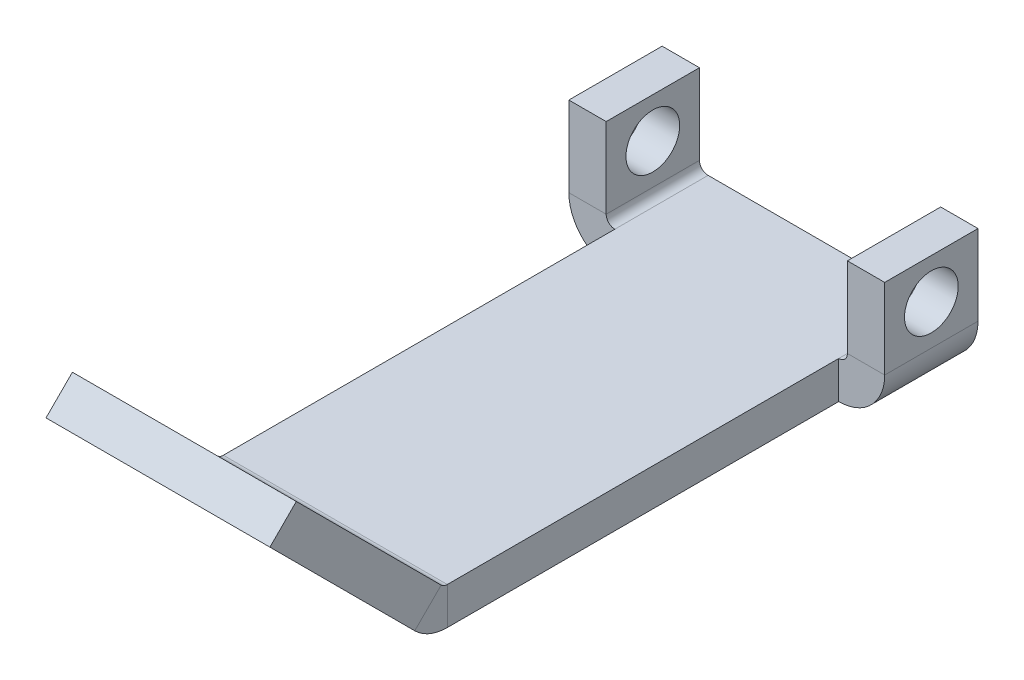
ISO-10303-21;
HEADER;
FILE_DESCRIPTION(('STEP AP214'),'2;1');
FILE_NAME('part.step','',(''),(''),'','','');
FILE_SCHEMA(('AUTOMOTIVE_DESIGN { 1 0 10303 214 1 1 1 1 }'));
ENDSEC;
DATA;
#1=APPLICATION_CONTEXT('core data for automotive mechanical design processes');
#2=APPLICATION_PROTOCOL_DEFINITION('international standard','automotive_design',2000,#1);
#3=PRODUCT_CONTEXT('',#1,'mechanical');
#4=PRODUCT('Part','Part','',(#3));
#5=PRODUCT_RELATED_PRODUCT_CATEGORY('part','',(#4));
#6=PRODUCT_DEFINITION_FORMATION('','',#4);
#7=PRODUCT_DEFINITION_CONTEXT('part definition',#1,'design');
#8=PRODUCT_DEFINITION('design','',#6,#7);
#9=PRODUCT_DEFINITION_SHAPE('','',#8);
#10=(LENGTH_UNIT() NAMED_UNIT(*) SI_UNIT(.MILLI.,.METRE.));
#11=(NAMED_UNIT(*) PLANE_ANGLE_UNIT() SI_UNIT($,.RADIAN.));
#12=(NAMED_UNIT(*) SI_UNIT($,.STERADIAN.) SOLID_ANGLE_UNIT());
#13=UNCERTAINTY_MEASURE_WITH_UNIT(LENGTH_MEASURE(1.E-05),#10,'distance_accuracy_value','');
#14=(GEOMETRIC_REPRESENTATION_CONTEXT(3) GLOBAL_UNCERTAINTY_ASSIGNED_CONTEXT((#13)) GLOBAL_UNIT_ASSIGNED_CONTEXT((#10,
#11,#12)) REPRESENTATION_CONTEXT('',''));
#15=CARTESIAN_POINT('',(0.,0.,0.));
#16=DIRECTION('',(0.,0.,1.));
#17=DIRECTION('',(1.,0.,0.));
#18=AXIS2_PLACEMENT_3D('',#15,#16,#17);
#19=CARTESIAN_POINT('',(0.,0.,0.));
#20=DIRECTION('',(0.,1.,0.));
#21=DIRECTION('',(0.,0.,1.));
#22=AXIS2_PLACEMENT_3D('',#19,#20,#21);
#23=PLANE('',#22);
#24=DIRECTION('',(0.,0.,1.));
#25=VECTOR('',#24,1.);
#26=CARTESIAN_POINT('',(0.,0.,0.));
#27=LINE('',#26,#25);
#28=CARTESIAN_POINT('',(0.,0.,-38.1));
#29=VERTEX_POINT('',#28);
#30=CARTESIAN_POINT('',(0.,0.,-4.79523777057862));
#31=VERTEX_POINT('',#30);
#32=EDGE_CURVE('E352',#29,#31,#27,.T.);
#33=ORIENTED_EDGE('',*,*,#32,.T.);
#34=DIRECTION('',(1.,0.,0.));
#35=VECTOR('',#34,1.);
#36=CARTESIAN_POINT('',(19.05,0.,-4.79523777057862));
#37=LINE('',#36,#35);
#38=CARTESIAN_POINT('',(19.05,0.,-4.79523777057862));
#39=VERTEX_POINT('',#38);
#40=EDGE_CURVE('E264',#39,#31,#37,.F.);
#41=ORIENTED_EDGE('',*,*,#40,.F.);
#42=DIRECTION('',(0.,0.,-1.));
#43=VECTOR('',#42,1.);
#44=CARTESIAN_POINT('',(19.05,0.,0.));
#45=LINE('',#44,#43);
#46=CARTESIAN_POINT('',(19.05,0.,-38.1));
#47=VERTEX_POINT('',#46);
#48=EDGE_CURVE('E98',#39,#47,#45,.T.);
#49=ORIENTED_EDGE('',*,*,#48,.T.);
#50=DIRECTION('',(0.,0.,1.));
#51=VECTOR('',#50,1.);
#52=CARTESIAN_POINT('',(19.05,0.,0.));
#53=LINE('',#52,#51);
#54=CARTESIAN_POINT('',(19.05,0.,-46.0375));
#55=VERTEX_POINT('',#54);
#56=EDGE_CURVE('E372',#55,#47,#53,.T.);
#57=ORIENTED_EDGE('',*,*,#56,.F.);
#58=DIRECTION('',(-1.,0.,0.));
#59=VECTOR('',#58,1.);
#60=CARTESIAN_POINT('',(29.5275,0.,-46.0375));
#61=LINE('',#60,#59);
#62=CARTESIAN_POINT('',(0.,0.,-46.0375));
#63=VERTEX_POINT('',#62);
#64=EDGE_CURVE('E361',#55,#63,#61,.T.);
#65=ORIENTED_EDGE('',*,*,#64,.T.);
#66=DIRECTION('',(0.,0.,1.));
#67=VECTOR('',#66,1.);
#68=CARTESIAN_POINT('',(0.,0.,0.));
#69=LINE('',#68,#67);
#70=EDGE_CURVE('E82',#63,#29,#69,.T.);
#71=ORIENTED_EDGE('',*,*,#70,.T.);
#72=EDGE_LOOP('',(#33,#41,#49,#57,#65,#71));
#73=FACE_BOUND('',#72,.T.);
#74=ADVANCED_FACE('F73',(#73),#23,.T.);
#75=CARTESIAN_POINT('',(0.,-3.175,0.));
#76=DIRECTION('',(0.,1.,0.));
#77=DIRECTION('',(0.,0.,1.));
#78=AXIS2_PLACEMENT_3D('',#75,#76,#77);
#79=PLANE('',#78);
#80=DIRECTION('',(1.,0.,0.));
#81=VECTOR('',#80,1.);
#82=CARTESIAN_POINT('',(19.05,-3.175,-4.79523777057862));
#83=LINE('',#82,#81);
#84=CARTESIAN_POINT('',(19.05,-3.175,-4.79523777057862));
#85=VERTEX_POINT('',#84);
#86=CARTESIAN_POINT('',(0.,-3.175,-4.79523777057862));
#87=VERTEX_POINT('',#86);
#88=EDGE_CURVE('E209',#85,#87,#83,.F.);
#89=ORIENTED_EDGE('',*,*,#88,.T.);
#90=DIRECTION('',(0.,0.,1.));
#91=VECTOR('',#90,1.);
#92=CARTESIAN_POINT('',(0.,-3.175,0.));
#93=LINE('',#92,#91);
#94=CARTESIAN_POINT('',(0.,-3.175,-38.1));
#95=VERTEX_POINT('',#94);
#96=EDGE_CURVE('E357',#95,#87,#93,.T.);
#97=ORIENTED_EDGE('',*,*,#96,.F.);
#98=DIRECTION('',(0.,0.,1.));
#99=VECTOR('',#98,1.);
#100=CARTESIAN_POINT('',(0.,-3.175,0.));
#101=LINE('',#100,#99);
#102=CARTESIAN_POINT('',(0.,-3.175,-46.0375));
#103=VERTEX_POINT('',#102);
#104=EDGE_CURVE('E377',#103,#95,#101,.T.);
#105=ORIENTED_EDGE('',*,*,#104,.F.);
#106=DIRECTION('',(-1.,0.,0.));
#107=VECTOR('',#106,1.);
#108=CARTESIAN_POINT('',(29.5275,-3.175,-46.0375));
#109=LINE('',#108,#107);
#110=CARTESIAN_POINT('',(19.05,-3.175,-46.0375));
#111=VERTEX_POINT('',#110);
#112=EDGE_CURVE('E363',#111,#103,#109,.T.);
#113=ORIENTED_EDGE('',*,*,#112,.F.);
#114=DIRECTION('',(0.,0.,1.));
#115=VECTOR('',#114,1.);
#116=CARTESIAN_POINT('',(19.05,-3.175,0.));
#117=LINE('',#116,#115);
#118=CARTESIAN_POINT('',(19.05,-3.175,-38.1));
#119=VERTEX_POINT('',#118);
#120=EDGE_CURVE('E367',#111,#119,#117,.T.);
#121=ORIENTED_EDGE('',*,*,#120,.T.);
#122=DIRECTION('',(0.,0.,-1.));
#123=VECTOR('',#122,1.);
#124=CARTESIAN_POINT('',(19.05,-3.175,0.));
#125=LINE('',#124,#123);
#126=EDGE_CURVE('E360',#85,#119,#125,.T.);
#127=ORIENTED_EDGE('',*,*,#126,.F.);
#128=EDGE_LOOP('',(#89,#97,#105,#113,#121,#127));
#129=FACE_BOUND('',#128,.T.);
#130=ADVANCED_FACE('F398',(#129),#79,.F.);
#131=CARTESIAN_POINT('',(19.05,-3.175,0.));
#132=DIRECTION('',(1.,0.,0.));
#133=DIRECTION('',(0.,0.,-1.));
#134=AXIS2_PLACEMENT_3D('',#131,#132,#133);
#135=PLANE('',#134);
#136=ORIENTED_EDGE('',*,*,#48,.F.);
#137=DIRECTION('',(0.,-1.,0.));
#138=VECTOR('',#137,1.);
#139=CARTESIAN_POINT('',(19.05,0.,-4.79523777057862));
#140=LINE('',#139,#138);
#141=EDGE_CURVE('E260',#39,#85,#140,.T.);
#142=ORIENTED_EDGE('',*,*,#141,.T.);
#143=ORIENTED_EDGE('',*,*,#126,.T.);
#144=DIRECTION('',(0.,1.,0.));
#145=VECTOR('',#144,1.);
#146=CARTESIAN_POINT('',(19.05,-3.175,-38.1));
#147=LINE('',#146,#145);
#148=EDGE_CURVE('E374',#119,#47,#147,.T.);
#149=ORIENTED_EDGE('',*,*,#148,.T.);
#150=EDGE_LOOP('',(#136,#142,#143,#149));
#151=FACE_BOUND('',#150,.T.);
#152=ADVANCED_FACE('F442',(#151),#135,.T.);
#153=CARTESIAN_POINT('',(29.5275,-3.175,-46.0375));
#154=DIRECTION('',(0.,0.,-1.));
#155=DIRECTION('',(-1.,0.,0.));
#156=AXIS2_PLACEMENT_3D('',#153,#154,#155);
#157=PLANE('',#156);
#158=ORIENTED_EDGE('',*,*,#112,.T.);
#159=DIRECTION('',(0.,1.,0.));
#160=VECTOR('',#159,1.);
#161=CARTESIAN_POINT('',(0.,-3.175,-46.0375));
#162=LINE('',#161,#160);
#163=EDGE_CURVE('E13',#103,#63,#162,.T.);
#164=ORIENTED_EDGE('',*,*,#163,.T.);
#165=ORIENTED_EDGE('',*,*,#64,.F.);
#166=DIRECTION('',(0.,1.,0.));
#167=VECTOR('',#166,1.);
#168=CARTESIAN_POINT('',(19.05,-3.175,-46.0375));
#169=LINE('',#168,#167);
#170=EDGE_CURVE('E370',#111,#55,#169,.T.);
#171=ORIENTED_EDGE('',*,*,#170,.F.);
#172=EDGE_LOOP('',(#158,#164,#165,#171));
#173=FACE_BOUND('',#172,.T.);
#174=ADVANCED_FACE('F75',(#173),#157,.T.);
#175=CARTESIAN_POINT('',(0.,-3.175,0.));
#176=DIRECTION('',(-1.,0.,0.));
#177=DIRECTION('',(0.,0.,1.));
#178=AXIS2_PLACEMENT_3D('',#175,#176,#177);
#179=PLANE('',#178);
#180=DIRECTION('',(0.,-1.,0.));
#181=VECTOR('',#180,1.);
#182=CARTESIAN_POINT('',(0.,0.,-4.79523777057862));
#183=LINE('',#182,#181);
#184=EDGE_CURVE('E268',#31,#87,#183,.T.);
#185=ORIENTED_EDGE('',*,*,#184,.F.);
#186=ORIENTED_EDGE('',*,*,#32,.F.);
#187=DIRECTION('',(0.,1.,0.));
#188=VECTOR('',#187,1.);
#189=CARTESIAN_POINT('',(0.,-3.175,-38.1));
#190=LINE('',#189,#188);
#191=EDGE_CURVE('E379',#95,#29,#190,.T.);
#192=ORIENTED_EDGE('',*,*,#191,.F.);
#193=ORIENTED_EDGE('',*,*,#96,.T.);
#194=EDGE_LOOP('',(#185,#186,#192,#193));
#195=FACE_BOUND('',#194,.T.);
#196=ADVANCED_FACE('F402',(#195),#179,.T.);
#197=CARTESIAN_POINT('',(19.05,0.7366,-46.0375));
#198=DIRECTION('',(0.,0.,-1.));
#199=DIRECTION('',(-1.,0.,0.));
#200=AXIS2_PLACEMENT_3D('',#197,#198,#199);
#201=PLANE('',#200);
#202=ORIENTED_EDGE('',*,*,#170,.T.);
#203=CARTESIAN_POINT('',(19.05,0.7366,-46.0375));
#204=DIRECTION('',(0.,0.,1.));
#205=DIRECTION('',(1.,0.,0.));
#206=AXIS2_PLACEMENT_3D('',#203,#204,#205);
#207=CIRCLE('',#206,0.7366);
#208=CARTESIAN_POINT('',(19.7866,0.736600000000004,-46.0375));
#209=VERTEX_POINT('',#208);
#210=EDGE_CURVE('E317',#55,#209,#207,.T.);
#211=ORIENTED_EDGE('',*,*,#210,.T.);
#212=DIRECTION('',(-1.,0.,0.));
#213=VECTOR('',#212,1.);
#214=CARTESIAN_POINT('',(22.9616,0.736600000000014,-46.0375));
#215=LINE('',#214,#213);
#216=CARTESIAN_POINT('',(22.9616,0.736600000000014,-46.0375));
#217=VERTEX_POINT('',#216);
#218=EDGE_CURVE('E332',#217,#209,#215,.T.);
#219=ORIENTED_EDGE('',*,*,#218,.F.);
#220=CARTESIAN_POINT('',(19.05,0.7366,-46.0375));
#221=DIRECTION('',(0.,0.,1.));
#222=DIRECTION('',(-1.,0.,0.));
#223=AXIS2_PLACEMENT_3D('',#220,#221,#222);
#224=CIRCLE('',#223,3.9116);
#225=EDGE_CURVE('E345',#111,#217,#224,.T.);
#226=ORIENTED_EDGE('',*,*,#225,.F.);
#227=EDGE_LOOP('',(#202,#211,#219,#226));
#228=FACE_BOUND('',#227,.T.);
#229=ADVANCED_FACE('F447',(#228),#201,.T.);
#230=CARTESIAN_POINT('',(19.05,0.7366,-38.1));
#231=DIRECTION('',(0.,0.,1.));
#232=DIRECTION('',(1.,0.,0.));
#233=AXIS2_PLACEMENT_3D('',#230,#231,#232);
#234=PLANE('',#233);
#235=DIRECTION('',(1.,0.,0.));
#236=VECTOR('',#235,1.);
#237=CARTESIAN_POINT('',(22.9616,0.736600000000014,-38.1));
#238=LINE('',#237,#236);
#239=CARTESIAN_POINT('',(19.7866,0.736600000000004,-38.1));
#240=VERTEX_POINT('',#239);
#241=CARTESIAN_POINT('',(22.9616,0.736600000000011,-38.1));
#242=VERTEX_POINT('',#241);
#243=EDGE_CURVE('E320',#240,#242,#238,.T.);
#244=ORIENTED_EDGE('',*,*,#243,.F.);
#245=CARTESIAN_POINT('',(19.05,0.7366,-38.1));
#246=DIRECTION('',(0.,0.,1.));
#247=DIRECTION('',(1.,0.,0.));
#248=AXIS2_PLACEMENT_3D('',#245,#246,#247);
#249=CIRCLE('',#248,0.7366);
#250=EDGE_CURVE('E349',#240,#47,#249,.F.);
#251=ORIENTED_EDGE('',*,*,#250,.T.);
#252=ORIENTED_EDGE('',*,*,#148,.F.);
#253=CARTESIAN_POINT('',(19.05,0.7366,-38.1));
#254=DIRECTION('',(0.,0.,-1.));
#255=DIRECTION('',(1.,0.,0.));
#256=AXIS2_PLACEMENT_3D('',#253,#254,#255);
#257=CIRCLE('',#256,3.9116);
#258=EDGE_CURVE('E348',#242,#119,#257,.T.);
#259=ORIENTED_EDGE('',*,*,#258,.F.);
#260=EDGE_LOOP('',(#244,#251,#252,#259));
#261=FACE_BOUND('',#260,.T.);
#262=ADVANCED_FACE('F453',(#261),#234,.T.);
#263=CARTESIAN_POINT('',(19.05,0.7366,-51.3645583159911));
#264=DIRECTION('',(0.,0.,1.));
#265=DIRECTION('',(1.,0.,0.));
#266=AXIS2_PLACEMENT_3D('',#263,#264,#265);
#267=CYLINDRICAL_SURFACE('',#266,3.9116);
#268=ORIENTED_EDGE('',*,*,#258,.T.);
#269=ORIENTED_EDGE('',*,*,#120,.F.);
#270=ORIENTED_EDGE('',*,*,#225,.T.);
#271=DIRECTION('',(0.,0.,1.));
#272=VECTOR('',#271,1.);
#273=CARTESIAN_POINT('',(22.9616,0.736600000000014,0.));
#274=LINE('',#273,#272);
#275=EDGE_CURVE('E310',#217,#242,#274,.T.);
#276=ORIENTED_EDGE('',*,*,#275,.T.);
#277=EDGE_LOOP('',(#268,#269,#270,#276));
#278=FACE_BOUND('',#277,.T.);
#279=ADVANCED_FACE('F457',(#278),#267,.T.);
#280=CARTESIAN_POINT('',(19.05,0.7366,-51.3645583159911));
#281=DIRECTION('',(0.,0.,1.));
#282=DIRECTION('',(1.,0.,0.));
#283=AXIS2_PLACEMENT_3D('',#280,#281,#282);
#284=CYLINDRICAL_SURFACE('',#283,0.7366);
#285=ORIENTED_EDGE('',*,*,#250,.F.);
#286=DIRECTION('',(0.,0.,1.));
#287=VECTOR('',#286,1.);
#288=CARTESIAN_POINT('',(19.7866,0.736600000000004,0.));
#289=LINE('',#288,#287);
#290=EDGE_CURVE('E327',#209,#240,#289,.T.);
#291=ORIENTED_EDGE('',*,*,#290,.F.);
#292=ORIENTED_EDGE('',*,*,#210,.F.);
#293=ORIENTED_EDGE('',*,*,#56,.T.);
#294=EDGE_LOOP('',(#285,#291,#292,#293));
#295=FACE_BOUND('',#294,.T.);
#296=ADVANCED_FACE('F459',(#295),#284,.F.);
#297=CARTESIAN_POINT('',(22.9616,7.56341225689599,-38.1));
#298=DIRECTION('',(0.,1.,0.));
#299=DIRECTION('',(0.,0.,-1.));
#300=AXIS2_PLACEMENT_3D('',#297,#298,#299);
#301=PLANE('',#300);
#302=DIRECTION('',(0.,0.,-1.));
#303=VECTOR('',#302,1.);
#304=CARTESIAN_POINT('',(19.7866,7.56341225689598,-38.1));
#305=LINE('',#304,#303);
#306=CARTESIAN_POINT('',(19.7866,7.56341225689598,-38.1));
#307=VERTEX_POINT('',#306);
#308=CARTESIAN_POINT('',(19.7866,7.56341225689598,-46.0375));
#309=VERTEX_POINT('',#308);
#310=EDGE_CURVE('E322',#307,#309,#305,.T.);
#311=ORIENTED_EDGE('',*,*,#310,.F.);
#312=DIRECTION('',(-1.,0.,0.));
#313=VECTOR('',#312,1.);
#314=CARTESIAN_POINT('',(22.9616,7.56341225689599,-38.1));
#315=LINE('',#314,#313);
#316=CARTESIAN_POINT('',(22.9616,7.56341225689599,-38.1));
#317=VERTEX_POINT('',#316);
#318=EDGE_CURVE('E314',#317,#307,#315,.T.);
#319=ORIENTED_EDGE('',*,*,#318,.F.);
#320=DIRECTION('',(0.,0.,-1.));
#321=VECTOR('',#320,1.);
#322=CARTESIAN_POINT('',(22.9616,7.56341225689599,-38.1));
#323=LINE('',#322,#321);
#324=CARTESIAN_POINT('',(22.9616,7.56341225689599,-46.0375));
#325=VERTEX_POINT('',#324);
#326=EDGE_CURVE('E340',#317,#325,#323,.T.);
#327=ORIENTED_EDGE('',*,*,#326,.T.);
#328=DIRECTION('',(-1.,0.,0.));
#329=VECTOR('',#328,1.);
#330=CARTESIAN_POINT('',(22.9616,7.56341225689599,-46.0375));
#331=LINE('',#330,#329);
#332=EDGE_CURVE('E338',#325,#309,#331,.T.);
#333=ORIENTED_EDGE('',*,*,#332,.T.);
#334=EDGE_LOOP('',(#311,#319,#327,#333));
#335=FACE_BOUND('',#334,.T.);
#336=ADVANCED_FACE('F462',(#335),#301,.T.);
#337=CARTESIAN_POINT('',(22.9616000000001,-21.964087743104,0.));
#338=DIRECTION('',(-1.,0.,0.));
#339=DIRECTION('',(0.,0.,1.));
#340=AXIS2_PLACEMENT_3D('',#337,#338,#339);
#341=PLANE('',#340);
#342=CARTESIAN_POINT('',(22.9616,4.15000612844791,-42.06875));
#343=DIRECTION('',(-1.,0.,0.));
#344=DIRECTION('',(0.,-1.,0.));
#345=AXIS2_PLACEMENT_3D('',#342,#343,#344);
#346=CIRCLE('',#345,2.286);
#347=CARTESIAN_POINT('',(22.9616,1.8640061284479,-42.06875));
#348=VERTEX_POINT('',#347);
#349=EDGE_CURVE('E787',#348,#348,#346,.T.);
#350=ORIENTED_EDGE('',*,*,#349,.T.);
#351=EDGE_LOOP('',(#350));
#352=FACE_BOUND('',#351,.T.);
#353=ORIENTED_EDGE('',*,*,#275,.F.);
#354=DIRECTION('',(0.,-1.,0.));
#355=VECTOR('',#354,1.);
#356=CARTESIAN_POINT('',(22.9616,7.56341225689599,-46.0375));
#357=LINE('',#356,#355);
#358=EDGE_CURVE('E335',#325,#217,#357,.T.);
#359=ORIENTED_EDGE('',*,*,#358,.F.);
#360=ORIENTED_EDGE('',*,*,#326,.F.);
#361=DIRECTION('',(0.,1.,0.));
#362=VECTOR('',#361,1.);
#363=CARTESIAN_POINT('',(22.9616,-2.91408774310401,-38.1));
#364=LINE('',#363,#362);
#365=EDGE_CURVE('E318',#242,#317,#364,.T.);
#366=ORIENTED_EDGE('',*,*,#365,.F.);
#367=EDGE_LOOP('',(#353,#359,#360,#366));
#368=FACE_BOUND('',#367,.T.);
#369=ADVANCED_FACE('F478',(#352,#368),#341,.F.);
#370=CARTESIAN_POINT('',(22.9616,7.56341225689599,-46.0375));
#371=DIRECTION('',(0.,0.,-1.));
#372=DIRECTION('',(0.,-1.,0.));
#373=AXIS2_PLACEMENT_3D('',#370,#371,#372);
#374=PLANE('',#373);
#375=ORIENTED_EDGE('',*,*,#358,.T.);
#376=ORIENTED_EDGE('',*,*,#218,.T.);
#377=DIRECTION('',(0.,-1.,0.));
#378=VECTOR('',#377,1.);
#379=CARTESIAN_POINT('',(19.7866,7.56341225689598,-46.0375));
#380=LINE('',#379,#378);
#381=EDGE_CURVE('E330',#309,#209,#380,.T.);
#382=ORIENTED_EDGE('',*,*,#381,.F.);
#383=ORIENTED_EDGE('',*,*,#332,.F.);
#384=EDGE_LOOP('',(#375,#376,#382,#383));
#385=FACE_BOUND('',#384,.T.);
#386=ADVANCED_FACE('F474',(#385),#374,.T.);
#387=CARTESIAN_POINT('',(19.7866000000001,-21.964087743104,0.));
#388=DIRECTION('',(-1.,0.,0.));
#389=DIRECTION('',(0.,0.,1.));
#390=AXIS2_PLACEMENT_3D('',#387,#388,#389);
#391=PLANE('',#390);
#392=CARTESIAN_POINT('',(19.7866,4.15000612844792,-42.06875));
#393=DIRECTION('',(-1.,0.,0.));
#394=DIRECTION('',(0.,-1.,0.));
#395=AXIS2_PLACEMENT_3D('',#392,#393,#394);
#396=CIRCLE('',#395,2.286);
#397=CARTESIAN_POINT('',(19.7866,1.86400612844792,-42.06875));
#398=VERTEX_POINT('',#397);
#399=EDGE_CURVE('E257',#398,#398,#396,.T.);
#400=ORIENTED_EDGE('',*,*,#399,.F.);
#401=EDGE_LOOP('',(#400));
#402=FACE_BOUND('',#401,.T.);
#403=ORIENTED_EDGE('',*,*,#381,.T.);
#404=ORIENTED_EDGE('',*,*,#290,.T.);
#405=DIRECTION('',(0.,1.,0.));
#406=VECTOR('',#405,1.);
#407=CARTESIAN_POINT('',(19.7866,-2.91408774310402,-38.1));
#408=LINE('',#407,#406);
#409=EDGE_CURVE('E325',#240,#307,#408,.T.);
#410=ORIENTED_EDGE('',*,*,#409,.T.);
#411=ORIENTED_EDGE('',*,*,#310,.T.);
#412=EDGE_LOOP('',(#403,#404,#410,#411));
#413=FACE_BOUND('',#412,.T.);
#414=ADVANCED_FACE('F470',(#402,#413),#391,.T.);
#415=CARTESIAN_POINT('',(22.9616,-2.91408774310401,-38.1));
#416=DIRECTION('',(0.,0.,1.));
#417=DIRECTION('',(0.,1.,0.));
#418=AXIS2_PLACEMENT_3D('',#415,#416,#417);
#419=PLANE('',#418);
#420=ORIENTED_EDGE('',*,*,#409,.F.);
#421=ORIENTED_EDGE('',*,*,#243,.T.);
#422=ORIENTED_EDGE('',*,*,#365,.T.);
#423=ORIENTED_EDGE('',*,*,#318,.T.);
#424=EDGE_LOOP('',(#420,#421,#422,#423));
#425=FACE_BOUND('',#424,.T.);
#426=ADVANCED_FACE('F467',(#425),#419,.T.);
#427=CARTESIAN_POINT('',(0.,0.7366,-46.0375));
#428=DIRECTION('',(0.,0.,-1.));
#429=DIRECTION('',(-1.,0.,0.));
#430=AXIS2_PLACEMENT_3D('',#427,#428,#429);
#431=PLANE('',#430);
#432=DIRECTION('',(1.,0.,0.));
#433=VECTOR('',#432,1.);
#434=CARTESIAN_POINT('',(-3.9116,0.736600000000013,-46.0375));
#435=LINE('',#434,#433);
#436=CARTESIAN_POINT('',(-3.9116,0.736600000000017,-46.0375));
#437=VERTEX_POINT('',#436);
#438=CARTESIAN_POINT('',(-0.736600000000001,0.736600000000001,-46.0375));
#439=VERTEX_POINT('',#438);
#440=EDGE_CURVE('E271',#437,#439,#435,.T.);
#441=ORIENTED_EDGE('',*,*,#440,.T.);
#442=CARTESIAN_POINT('',(0.,0.7366,-46.0375));
#443=DIRECTION('',(0.,0.,-1.));
#444=DIRECTION('',(-1.,0.,0.));
#445=AXIS2_PLACEMENT_3D('',#442,#443,#444);
#446=CIRCLE('',#445,0.7366);
#447=EDGE_CURVE('E90',#439,#63,#446,.F.);
#448=ORIENTED_EDGE('',*,*,#447,.T.);
#449=ORIENTED_EDGE('',*,*,#163,.F.);
#450=CARTESIAN_POINT('',(0.,0.7366,-46.0375));
#451=DIRECTION('',(0.,0.,1.));
#452=DIRECTION('',(-1.,0.,0.));
#453=AXIS2_PLACEMENT_3D('',#450,#451,#452);
#454=CIRCLE('',#453,3.9116);
#455=EDGE_CURVE('E303',#437,#103,#454,.T.);
#456=ORIENTED_EDGE('',*,*,#455,.F.);
#457=EDGE_LOOP('',(#441,#448,#449,#456));
#458=FACE_BOUND('',#457,.T.);
#459=ADVANCED_FACE('F390',(#458),#431,.T.);
#460=CARTESIAN_POINT('',(0.,0.7366,-38.1));
#461=DIRECTION('',(0.,0.,1.));
#462=DIRECTION('',(1.,0.,0.));
#463=AXIS2_PLACEMENT_3D('',#460,#461,#462);
#464=PLANE('',#463);
#465=CARTESIAN_POINT('',(0.,0.7366,-38.1));
#466=DIRECTION('',(0.,0.,-1.));
#467=DIRECTION('',(-1.,0.,0.));
#468=AXIS2_PLACEMENT_3D('',#465,#466,#467);
#469=CIRCLE('',#468,0.7366);
#470=CARTESIAN_POINT('',(-0.736600000000001,0.736599999999999,-38.1));
#471=VERTEX_POINT('',#470);
#472=EDGE_CURVE('E307',#29,#471,#469,.T.);
#473=ORIENTED_EDGE('',*,*,#472,.T.);
#474=DIRECTION('',(-1.,0.,0.));
#475=VECTOR('',#474,1.);
#476=CARTESIAN_POINT('',(-3.9116,0.73660000000001,-38.1));
#477=LINE('',#476,#475);
#478=CARTESIAN_POINT('',(-3.9116,0.73660000000001,-38.1));
#479=VERTEX_POINT('',#478);
#480=EDGE_CURVE('E296',#471,#479,#477,.T.);
#481=ORIENTED_EDGE('',*,*,#480,.T.);
#482=CARTESIAN_POINT('',(0.,0.7366,-38.1));
#483=DIRECTION('',(0.,0.,-1.));
#484=DIRECTION('',(1.,0.,0.));
#485=AXIS2_PLACEMENT_3D('',#482,#483,#484);
#486=CIRCLE('',#485,3.9116);
#487=EDGE_CURVE('E306',#95,#479,#486,.T.);
#488=ORIENTED_EDGE('',*,*,#487,.F.);
#489=ORIENTED_EDGE('',*,*,#191,.T.);
#490=EDGE_LOOP('',(#473,#481,#488,#489));
#491=FACE_BOUND('',#490,.T.);
#492=ADVANCED_FACE('F405',(#491),#464,.T.);
#493=CARTESIAN_POINT('',(0.,0.7366,-32.7729416840089));
#494=DIRECTION('',(0.,0.,-1.));
#495=DIRECTION('',(-1.,0.,0.));
#496=AXIS2_PLACEMENT_3D('',#493,#494,#495);
#497=CYLINDRICAL_SURFACE('',#496,3.9116);
#498=ORIENTED_EDGE('',*,*,#104,.T.);
#499=ORIENTED_EDGE('',*,*,#487,.T.);
#500=DIRECTION('',(0.,0.,1.));
#501=VECTOR('',#500,1.);
#502=CARTESIAN_POINT('',(-3.9116,0.73660000000001,0.));
#503=LINE('',#502,#501);
#504=EDGE_CURVE('E289',#437,#479,#503,.T.);
#505=ORIENTED_EDGE('',*,*,#504,.F.);
#506=ORIENTED_EDGE('',*,*,#455,.T.);
#507=EDGE_LOOP('',(#498,#499,#505,#506));
#508=FACE_BOUND('',#507,.T.);
#509=ADVANCED_FACE('F394',(#508),#497,.T.);
#510=CARTESIAN_POINT('',(0.,0.7366,-32.7729416840089));
#511=DIRECTION('',(0.,0.,-1.));
#512=DIRECTION('',(-1.,0.,0.));
#513=AXIS2_PLACEMENT_3D('',#510,#511,#512);
#514=CYLINDRICAL_SURFACE('',#513,0.7366);
#515=ORIENTED_EDGE('',*,*,#70,.F.);
#516=ORIENTED_EDGE('',*,*,#447,.F.);
#517=DIRECTION('',(0.,0.,1.));
#518=VECTOR('',#517,1.);
#519=CARTESIAN_POINT('',(-0.736600000000001,0.736599999999999,0.));
#520=LINE('',#519,#518);
#521=EDGE_CURVE('E299',#439,#471,#520,.T.);
#522=ORIENTED_EDGE('',*,*,#521,.T.);
#523=ORIENTED_EDGE('',*,*,#472,.F.);
#524=EDGE_LOOP('',(#515,#516,#522,#523));
#525=FACE_BOUND('',#524,.T.);
#526=ADVANCED_FACE('F407',(#525),#514,.F.);
#527=CARTESIAN_POINT('',(-3.91159999999998,7.56341225689598,-38.1));
#528=DIRECTION('',(0.,1.,0.));
#529=DIRECTION('',(0.,0.,1.));
#530=AXIS2_PLACEMENT_3D('',#527,#528,#529);
#531=PLANE('',#530);
#532=DIRECTION('',(0.,0.,1.));
#533=VECTOR('',#532,1.);
#534=CARTESIAN_POINT('',(-0.736599999999977,7.56341225689597,-38.1));
#535=LINE('',#534,#533);
#536=CARTESIAN_POINT('',(-0.736599999999977,7.56341225689597,-46.0375));
#537=VERTEX_POINT('',#536);
#538=CARTESIAN_POINT('',(-0.736599999999977,7.56341225689597,-38.1));
#539=VERTEX_POINT('',#538);
#540=EDGE_CURVE('E281',#537,#539,#535,.T.);
#541=ORIENTED_EDGE('',*,*,#540,.F.);
#542=DIRECTION('',(1.,0.,0.));
#543=VECTOR('',#542,1.);
#544=CARTESIAN_POINT('',(-3.91159999999998,7.56341225689598,-46.0375));
#545=LINE('',#544,#543);
#546=CARTESIAN_POINT('',(-3.91159999999998,7.56341225689598,-46.0375));
#547=VERTEX_POINT('',#546);
#548=EDGE_CURVE('E274',#547,#537,#545,.T.);
#549=ORIENTED_EDGE('',*,*,#548,.F.);
#550=DIRECTION('',(0.,0.,1.));
#551=VECTOR('',#550,1.);
#552=CARTESIAN_POINT('',(-3.91159999999998,7.56341225689598,-38.1));
#553=LINE('',#552,#551);
#554=CARTESIAN_POINT('',(-3.91159999999998,7.56341225689598,-38.1));
#555=VERTEX_POINT('',#554);
#556=EDGE_CURVE('E293',#547,#555,#553,.T.);
#557=ORIENTED_EDGE('',*,*,#556,.T.);
#558=DIRECTION('',(1.,0.,0.));
#559=VECTOR('',#558,1.);
#560=CARTESIAN_POINT('',(-3.91159999999998,7.56341225689598,-38.1));
#561=LINE('',#560,#559);
#562=EDGE_CURVE('E291',#555,#539,#561,.T.);
#563=ORIENTED_EDGE('',*,*,#562,.T.);
#564=EDGE_LOOP('',(#541,#549,#557,#563));
#565=FACE_BOUND('',#564,.T.);
#566=ADVANCED_FACE('F423',(#565),#531,.T.);
#567=CARTESIAN_POINT('',(-3.91160000000001,-2.91408774310402,0.));
#568=DIRECTION('',(1.,0.,0.));
#569=DIRECTION('',(0.,0.,1.));
#570=AXIS2_PLACEMENT_3D('',#567,#568,#569);
#571=PLANE('',#570);
#572=CARTESIAN_POINT('',(-3.91159999999999,4.150006128448,-42.06875));
#573=DIRECTION('',(-1.,0.,0.));
#574=DIRECTION('',(0.,-1.,0.));
#575=AXIS2_PLACEMENT_3D('',#572,#573,#574);
#576=CIRCLE('',#575,2.286);
#577=CARTESIAN_POINT('',(-3.9116,1.864006128448,-42.06875));
#578=VERTEX_POINT('',#577);
#579=EDGE_CURVE('E788',#578,#578,#576,.T.);
#580=ORIENTED_EDGE('',*,*,#579,.F.);
#581=EDGE_LOOP('',(#580));
#582=FACE_BOUND('',#581,.T.);
#583=DIRECTION('',(0.,1.,0.));
#584=VECTOR('',#583,1.);
#585=CARTESIAN_POINT('',(-3.91160000000012,-32.441587743104,-46.0375));
#586=LINE('',#585,#584);
#587=EDGE_CURVE('E277',#437,#547,#586,.T.);
#588=ORIENTED_EDGE('',*,*,#587,.F.);
#589=ORIENTED_EDGE('',*,*,#504,.T.);
#590=DIRECTION('',(0.,-1.,0.));
#591=VECTOR('',#590,1.);
#592=CARTESIAN_POINT('',(-3.91160000000001,-2.91408774310402,-38.1));
#593=LINE('',#592,#591);
#594=EDGE_CURVE('E286',#555,#479,#593,.T.);
#595=ORIENTED_EDGE('',*,*,#594,.F.);
#596=ORIENTED_EDGE('',*,*,#556,.F.);
#597=EDGE_LOOP('',(#588,#589,#595,#596));
#598=FACE_BOUND('',#597,.T.);
#599=ADVANCED_FACE('F419',(#582,#598),#571,.F.);
#600=CARTESIAN_POINT('',(-3.91160000000001,-2.91408774310402,-38.1));
#601=DIRECTION('',(0.,0.,1.));
#602=DIRECTION('',(0.,-1.,0.));
#603=AXIS2_PLACEMENT_3D('',#600,#601,#602);
#604=PLANE('',#603);
#605=ORIENTED_EDGE('',*,*,#480,.F.);
#606=DIRECTION('',(0.,-1.,0.));
#607=VECTOR('',#606,1.);
#608=CARTESIAN_POINT('',(-0.736600000000014,-2.91408774310403,-38.1));
#609=LINE('',#608,#607);
#610=EDGE_CURVE('E279',#539,#471,#609,.T.);
#611=ORIENTED_EDGE('',*,*,#610,.F.);
#612=ORIENTED_EDGE('',*,*,#562,.F.);
#613=ORIENTED_EDGE('',*,*,#594,.T.);
#614=EDGE_LOOP('',(#605,#611,#612,#613));
#615=FACE_BOUND('',#614,.T.);
#616=ADVANCED_FACE('F425',(#615),#604,.T.);
#617=CARTESIAN_POINT('',(-0.736600000000014,-2.91408774310403,0.));
#618=DIRECTION('',(1.,0.,0.));
#619=DIRECTION('',(0.,0.,1.));
#620=AXIS2_PLACEMENT_3D('',#617,#618,#619);
#621=PLANE('',#620);
#622=CARTESIAN_POINT('',(-0.73659999999999,4.15000612844799,-42.06875));
#623=DIRECTION('',(1.,0.,0.));
#624=DIRECTION('',(0.,1.,0.));
#625=AXIS2_PLACEMENT_3D('',#622,#623,#624);
#626=CIRCLE('',#625,2.286);
#627=CARTESIAN_POINT('',(-0.736599999999982,6.43600612844799,-42.06875));
#628=VERTEX_POINT('',#627);
#629=EDGE_CURVE('E77',#628,#628,#626,.T.);
#630=ORIENTED_EDGE('',*,*,#629,.F.);
#631=EDGE_LOOP('',(#630));
#632=FACE_BOUND('',#631,.T.);
#633=ORIENTED_EDGE('',*,*,#521,.F.);
#634=DIRECTION('',(0.,1.,0.));
#635=VECTOR('',#634,1.);
#636=CARTESIAN_POINT('',(-0.736600000000117,-32.441587743104,-46.0375));
#637=LINE('',#636,#635);
#638=EDGE_CURVE('E284',#439,#537,#637,.T.);
#639=ORIENTED_EDGE('',*,*,#638,.T.);
#640=ORIENTED_EDGE('',*,*,#540,.T.);
#641=ORIENTED_EDGE('',*,*,#610,.T.);
#642=EDGE_LOOP('',(#633,#639,#640,#641));
#643=FACE_BOUND('',#642,.T.);
#644=ADVANCED_FACE('F410',(#632,#643),#621,.T.);
#645=CARTESIAN_POINT('',(-3.91160000000012,-32.441587743104,-46.0375));
#646=DIRECTION('',(0.,0.,-1.));
#647=DIRECTION('',(0.,1.,0.));
#648=AXIS2_PLACEMENT_3D('',#645,#646,#647);
#649=PLANE('',#648);
#650=ORIENTED_EDGE('',*,*,#440,.F.);
#651=ORIENTED_EDGE('',*,*,#587,.T.);
#652=ORIENTED_EDGE('',*,*,#548,.T.);
#653=ORIENTED_EDGE('',*,*,#638,.F.);
#654=EDGE_LOOP('',(#650,#651,#652,#653));
#655=FACE_BOUND('',#654,.T.);
#656=ADVANCED_FACE('F415',(#655),#649,.T.);
#657=CARTESIAN_POINT('',(0.,0.7366,-4.79523777057862));
#658=DIRECTION('',(-1.,0.,0.));
#659=DIRECTION('',(0.,0.,1.));
#660=AXIS2_PLACEMENT_3D('',#657,#658,#659);
#661=PLANE('',#660);
#662=DIRECTION('',(0.,-0.707106781186551,0.707106781186544));
#663=VECTOR('',#662,1.);
#664=CARTESIAN_POINT('',(0.,-2.02931888528931,-2.02931888528934));
#665=LINE('',#664,#663);
#666=CARTESIAN_POINT('',(0.,0.215745144977986,-4.27438291555661));
#667=VERTEX_POINT('',#666);
#668=CARTESIAN_POINT('',(0.,-2.02931888528931,-2.02931888528933));
#669=VERTEX_POINT('',#668);
#670=EDGE_CURVE('E254',#667,#669,#665,.T.);
#671=ORIENTED_EDGE('',*,*,#670,.F.);
#672=CARTESIAN_POINT('',(0.,0.7366,-4.79523777057862));
#673=DIRECTION('',(1.,0.,0.));
#674=DIRECTION('',(0.,0.,-1.));
#675=AXIS2_PLACEMENT_3D('',#672,#673,#674);
#676=CIRCLE('',#675,0.7366);
#677=EDGE_CURVE('E212',#31,#667,#676,.F.);
#678=ORIENTED_EDGE('',*,*,#677,.F.);
#679=ORIENTED_EDGE('',*,*,#184,.T.);
#680=CARTESIAN_POINT('',(0.,0.7366,-4.79523777057862));
#681=DIRECTION('',(1.,0.,0.));
#682=DIRECTION('',(0.,0.,-1.));
#683=AXIS2_PLACEMENT_3D('',#680,#681,#682);
#684=CIRCLE('',#683,3.9116);
#685=EDGE_CURVE('E259',#87,#669,#684,.F.);
#686=ORIENTED_EDGE('',*,*,#685,.T.);
#687=EDGE_LOOP('',(#671,#678,#679,#686));
#688=FACE_BOUND('',#687,.T.);
#689=ADVANCED_FACE('F494',(#688),#661,.T.);
#690=CARTESIAN_POINT('',(19.05,0.7366,-4.79523777057862));
#691=DIRECTION('',(-1.,0.,0.));
#692=DIRECTION('',(0.,0.,1.));
#693=AXIS2_PLACEMENT_3D('',#690,#691,#692);
#694=PLANE('',#693);
#695=CARTESIAN_POINT('',(19.05,0.7366,-4.79523777057862));
#696=DIRECTION('',(1.,0.,0.));
#697=DIRECTION('',(0.,0.,-1.));
#698=AXIS2_PLACEMENT_3D('',#695,#696,#697);
#699=CIRCLE('',#698,0.7366);
#700=CARTESIAN_POINT('',(19.05,0.215745144977986,-4.27438291555661));
#701=VERTEX_POINT('',#700);
#702=EDGE_CURVE('E219',#701,#39,#699,.T.);
#703=ORIENTED_EDGE('',*,*,#702,.F.);
#704=DIRECTION('',(0.,-0.707106781186551,0.707106781186544));
#705=VECTOR('',#704,1.);
#706=CARTESIAN_POINT('',(19.05,0.215745144977986,-4.27438291555661));
#707=LINE('',#706,#705);
#708=CARTESIAN_POINT('',(19.05,-2.02931888528931,-2.02931888528934));
#709=VERTEX_POINT('',#708);
#710=EDGE_CURVE('E216',#701,#709,#707,.T.);
#711=ORIENTED_EDGE('',*,*,#710,.T.);
#712=CARTESIAN_POINT('',(19.05,0.7366,-4.79523777057862));
#713=DIRECTION('',(1.,0.,0.));
#714=DIRECTION('',(0.,0.,-1.));
#715=AXIS2_PLACEMENT_3D('',#712,#713,#714);
#716=CIRCLE('',#715,3.9116);
#717=EDGE_CURVE('E202',#709,#85,#716,.T.);
#718=ORIENTED_EDGE('',*,*,#717,.T.);
#719=ORIENTED_EDGE('',*,*,#141,.F.);
#720=EDGE_LOOP('',(#703,#711,#718,#719));
#721=FACE_BOUND('',#720,.T.);
#722=ADVANCED_FACE('F217',(#721),#694,.F.);
#723=CARTESIAN_POINT('',(19.05,0.7366,-4.79523777057862));
#724=DIRECTION('',(1.,0.,0.));
#725=DIRECTION('',(0.,-0.707106781186551,0.707106781186544));
#726=AXIS2_PLACEMENT_3D('',#723,#724,#725);
#727=CYLINDRICAL_SURFACE('',#726,3.9116);
#728=ORIENTED_EDGE('',*,*,#88,.F.);
#729=ORIENTED_EDGE('',*,*,#717,.F.);
#730=DIRECTION('',(1.,0.,0.));
#731=VECTOR('',#730,1.);
#732=CARTESIAN_POINT('',(0.,-2.02931888528931,-2.02931888528934));
#733=LINE('',#732,#731);
#734=EDGE_CURVE('E207',#669,#709,#733,.T.);
#735=ORIENTED_EDGE('',*,*,#734,.F.);
#736=ORIENTED_EDGE('',*,*,#685,.F.);
#737=EDGE_LOOP('',(#728,#729,#735,#736));
#738=FACE_BOUND('',#737,.T.);
#739=ADVANCED_FACE('F204',(#738),#727,.T.);
#740=CARTESIAN_POINT('',(19.05,0.7366,-4.79523777057862));
#741=DIRECTION('',(1.,0.,0.));
#742=DIRECTION('',(0.,-0.707106781186551,0.707106781186544));
#743=AXIS2_PLACEMENT_3D('',#740,#741,#742);
#744=CYLINDRICAL_SURFACE('',#743,0.7366);
#745=ORIENTED_EDGE('',*,*,#40,.T.);
#746=ORIENTED_EDGE('',*,*,#677,.T.);
#747=DIRECTION('',(-1.,0.,0.));
#748=VECTOR('',#747,1.);
#749=CARTESIAN_POINT('',(0.,0.215745144977986,-4.27438291555661));
#750=LINE('',#749,#748);
#751=EDGE_CURVE('E224',#667,#701,#750,.F.);
#752=ORIENTED_EDGE('',*,*,#751,.T.);
#753=ORIENTED_EDGE('',*,*,#702,.T.);
#754=EDGE_LOOP('',(#745,#746,#752,#753));
#755=FACE_BOUND('',#754,.T.);
#756=ADVANCED_FACE('F505',(#755),#744,.F.);
#757=CARTESIAN_POINT('',(19.05,-2.2450640302673,-2.24506403026732));
#758=DIRECTION('',(1.,0.,0.));
#759=DIRECTION('',(0.,0.,-1.));
#760=AXIS2_PLACEMENT_3D('',#757,#758,#759);
#761=PLANE('',#760);
#762=DIRECTION('',(0.,-0.707106781186544,-0.707106781186551));
#763=VECTOR('',#762,1.);
#764=CARTESIAN_POINT('',(19.05,-2.2450640302673,-2.24506403026732));
#765=LINE('',#764,#763);
#766=CARTESIAN_POINT('',(19.05,10.2953841816037,10.2953841816038));
#767=VERTEX_POINT('',#766);
#768=EDGE_CURVE('E231',#767,#709,#765,.T.);
#769=ORIENTED_EDGE('',*,*,#768,.T.);
#770=ORIENTED_EDGE('',*,*,#710,.F.);
#771=DIRECTION('',(0.,0.707106781186544,0.707106781186551));
#772=VECTOR('',#771,1.);
#773=CARTESIAN_POINT('',(19.05,0.,-4.4901280605346));
#774=LINE('',#773,#772);
#775=CARTESIAN_POINT('',(19.05,12.540448211871,8.05032015133649));
#776=VERTEX_POINT('',#775);
#777=EDGE_CURVE('E247',#776,#701,#774,.F.);
#778=ORIENTED_EDGE('',*,*,#777,.F.);
#779=DIRECTION('',(0.,0.707106781186551,-0.707106781186544));
#780=VECTOR('',#779,1.);
#781=CARTESIAN_POINT('',(19.05,10.2953841816037,10.2953841816038));
#782=LINE('',#781,#780);
#783=EDGE_CURVE('E236',#767,#776,#782,.T.);
#784=ORIENTED_EDGE('',*,*,#783,.F.);
#785=EDGE_LOOP('',(#769,#770,#778,#784));
#786=FACE_BOUND('',#785,.T.);
#787=ADVANCED_FACE('F235',(#786),#761,.T.);
#788=CARTESIAN_POINT('',(0.,10.2953841816037,10.2953841816038));
#789=DIRECTION('',(-1.,0.,0.));
#790=DIRECTION('',(0.,0.,1.));
#791=AXIS2_PLACEMENT_3D('',#788,#789,#790);
#792=PLANE('',#791);
#793=DIRECTION('',(0.,-0.707106781186544,-0.707106781186551));
#794=VECTOR('',#793,1.);
#795=CARTESIAN_POINT('',(0.,0.,-4.4901280605346));
#796=LINE('',#795,#794);
#797=CARTESIAN_POINT('',(0.,12.540448211871,8.05032015133649));
#798=VERTEX_POINT('',#797);
#799=EDGE_CURVE('E233',#667,#798,#796,.F.);
#800=ORIENTED_EDGE('',*,*,#799,.F.);
#801=ORIENTED_EDGE('',*,*,#670,.T.);
#802=DIRECTION('',(0.,0.707106781186544,0.707106781186551));
#803=VECTOR('',#802,1.);
#804=CARTESIAN_POINT('',(0.,10.2953841816037,10.2953841816038));
#805=LINE('',#804,#803);
#806=CARTESIAN_POINT('',(0.,10.2953841816037,10.2953841816038));
#807=VERTEX_POINT('',#806);
#808=EDGE_CURVE('E232',#669,#807,#805,.T.);
#809=ORIENTED_EDGE('',*,*,#808,.T.);
#810=DIRECTION('',(0.,0.707106781186551,-0.707106781186544));
#811=VECTOR('',#810,1.);
#812=CARTESIAN_POINT('',(0.,10.2953841816037,10.2953841816038));
#813=LINE('',#812,#811);
#814=EDGE_CURVE('E238',#807,#798,#813,.T.);
#815=ORIENTED_EDGE('',*,*,#814,.T.);
#816=EDGE_LOOP('',(#800,#801,#809,#815));
#817=FACE_BOUND('',#816,.T.);
#818=ADVANCED_FACE('F682',(#817),#792,.T.);
#819=CARTESIAN_POINT('',(0.,-2.2450640302673,-2.24506403026732));
#820=DIRECTION('',(0.,-0.707106781186551,0.707106781186544));
#821=DIRECTION('',(0.,-0.707106781186544,-0.707106781186551));
#822=AXIS2_PLACEMENT_3D('',#819,#820,#821);
#823=PLANE('',#822);
#824=ORIENTED_EDGE('',*,*,#808,.F.);
#825=ORIENTED_EDGE('',*,*,#734,.T.);
#826=ORIENTED_EDGE('',*,*,#768,.F.);
#827=DIRECTION('',(1.,0.,0.));
#828=VECTOR('',#827,1.);
#829=CARTESIAN_POINT('',(19.05,10.2953841816037,10.2953841816038));
#830=LINE('',#829,#828);
#831=EDGE_CURVE('E239',#807,#767,#830,.T.);
#832=ORIENTED_EDGE('',*,*,#831,.F.);
#833=EDGE_LOOP('',(#824,#825,#826,#832));
#834=FACE_BOUND('',#833,.T.);
#835=ADVANCED_FACE('F229',(#834),#823,.T.);
#836=CARTESIAN_POINT('',(0.,0.,-4.4901280605346));
#837=DIRECTION('',(0.,-0.707106781186551,0.707106781186544));
#838=DIRECTION('',(0.,-0.707106781186544,-0.707106781186551));
#839=AXIS2_PLACEMENT_3D('',#836,#837,#838);
#840=PLANE('',#839);
#841=ORIENTED_EDGE('',*,*,#751,.F.);
#842=ORIENTED_EDGE('',*,*,#799,.T.);
#843=DIRECTION('',(-1.,0.,0.));
#844=VECTOR('',#843,1.);
#845=CARTESIAN_POINT('',(0.,12.540448211871,8.05032015133649));
#846=LINE('',#845,#844);
#847=EDGE_CURVE('E249',#798,#776,#846,.F.);
#848=ORIENTED_EDGE('',*,*,#847,.T.);
#849=ORIENTED_EDGE('',*,*,#777,.T.);
#850=EDGE_LOOP('',(#841,#842,#848,#849));
#851=FACE_BOUND('',#850,.T.);
#852=ADVANCED_FACE('F698',(#851),#840,.F.);
#853=CARTESIAN_POINT('',(19.05,10.2953841816037,10.2953841816038));
#854=DIRECTION('',(0.,0.707106781186544,0.707106781186551));
#855=DIRECTION('',(0.,-0.707106781186551,0.707106781186544));
#856=AXIS2_PLACEMENT_3D('',#853,#854,#855);
#857=PLANE('',#856);
#858=ORIENTED_EDGE('',*,*,#847,.F.);
#859=ORIENTED_EDGE('',*,*,#814,.F.);
#860=ORIENTED_EDGE('',*,*,#831,.T.);
#861=ORIENTED_EDGE('',*,*,#783,.T.);
#862=EDGE_LOOP('',(#858,#859,#860,#861));
#863=FACE_BOUND('',#862,.T.);
#864=ADVANCED_FACE('F706',(#863),#857,.T.);
#865=CARTESIAN_POINT('',(22.9616,4.15000612844791,-42.06875));
#866=DIRECTION('',(-1.,0.,0.));
#867=DIRECTION('',(0.,-1.,0.));
#868=AXIS2_PLACEMENT_3D('',#865,#866,#867);
#869=CYLINDRICAL_SURFACE('',#868,2.286);
#870=ORIENTED_EDGE('',*,*,#629,.T.);
#871=EDGE_LOOP('',(#870));
#872=FACE_BOUND('',#871,.T.);
#873=ORIENTED_EDGE('',*,*,#579,.T.);
#874=EDGE_LOOP('',(#873));
#875=FACE_BOUND('',#874,.T.);
#876=ADVANCED_FACE('F715',(#872,#875),#869,.F.);
#877=ORIENTED_EDGE('',*,*,#399,.T.);
#878=EDGE_LOOP('',(#877));
#879=FACE_BOUND('',#878,.T.);
#880=ORIENTED_EDGE('',*,*,#349,.F.);
#881=EDGE_LOOP('',(#880));
#882=FACE_BOUND('',#881,.T.);
#883=ADVANCED_FACE('F724',(#879,#882),#869,.F.);
#884=CLOSED_SHELL('',(#74,#130,#152,#174,#196,#229,#262,#279,#296,#336,#369,#386,#414,#426,#459,
#492,#509,#526,#566,#599,#616,#644,#656,#689,#722,#739,#756,#787,#818,#835,#852,#864,#876,#883));
#885=MANIFOLD_SOLID_BREP('B2',#884);
#886=ADVANCED_BREP_SHAPE_REPRESENTATION('',(#18,#885),#14);
#887=SHAPE_DEFINITION_REPRESENTATION(#9,#886);
ENDSEC;
END-ISO-10303-21;
